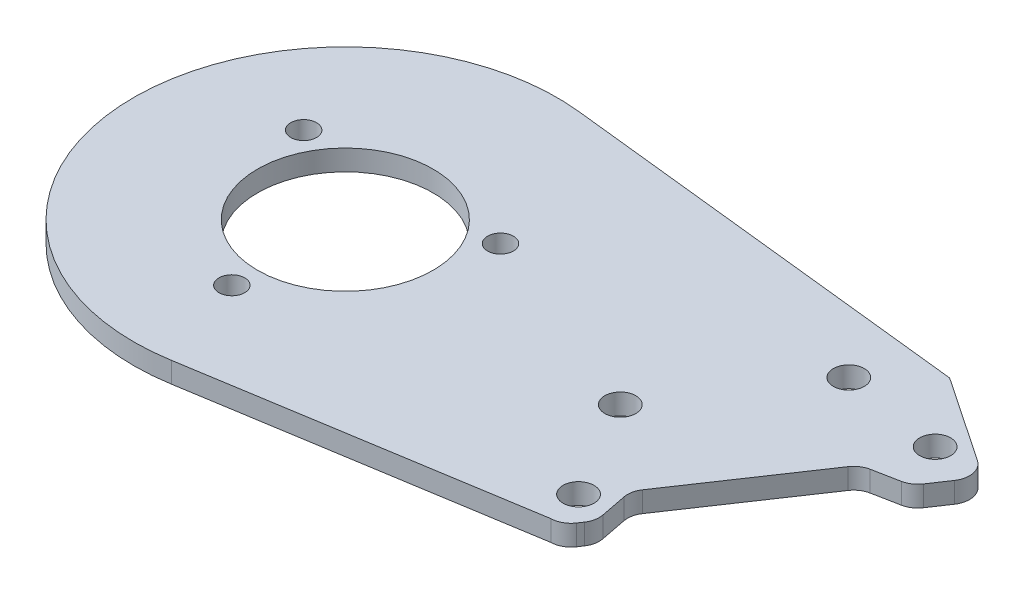
ISO-10303-21;
HEADER;
FILE_DESCRIPTION(('STEP AP214'),'2;1');
FILE_NAME('part.step','',(''),(''),'','','');
FILE_SCHEMA(('AUTOMOTIVE_DESIGN { 1 0 10303 214 1 1 1 1 }'));
ENDSEC;
DATA;
#1=APPLICATION_CONTEXT('core data for automotive mechanical design processes');
#2=APPLICATION_PROTOCOL_DEFINITION('international standard','automotive_design',2000,#1);
#3=PRODUCT_CONTEXT('',#1,'mechanical');
#4=PRODUCT('Part','Part','',(#3));
#5=PRODUCT_RELATED_PRODUCT_CATEGORY('part','',(#4));
#6=PRODUCT_DEFINITION_FORMATION('','',#4);
#7=PRODUCT_DEFINITION_CONTEXT('part definition',#1,'design');
#8=PRODUCT_DEFINITION('design','',#6,#7);
#9=PRODUCT_DEFINITION_SHAPE('','',#8);
#10=(LENGTH_UNIT() NAMED_UNIT(*) SI_UNIT(.MILLI.,.METRE.));
#11=(NAMED_UNIT(*) PLANE_ANGLE_UNIT() SI_UNIT($,.RADIAN.));
#12=(NAMED_UNIT(*) SI_UNIT($,.STERADIAN.) SOLID_ANGLE_UNIT());
#13=UNCERTAINTY_MEASURE_WITH_UNIT(LENGTH_MEASURE(1.E-05),#10,'distance_accuracy_value','');
#14=(GEOMETRIC_REPRESENTATION_CONTEXT(3) GLOBAL_UNCERTAINTY_ASSIGNED_CONTEXT((#13)) GLOBAL_UNIT_ASSIGNED_CONTEXT((#10,
#11,#12)) REPRESENTATION_CONTEXT('',''));
#15=CARTESIAN_POINT('',(0.,0.,0.));
#16=DIRECTION('',(0.,0.,1.));
#17=DIRECTION('',(1.,0.,0.));
#18=AXIS2_PLACEMENT_3D('',#15,#16,#17);
#19=CARTESIAN_POINT('',(-128.647957340767,2.,42.1311218192223));
#20=DIRECTION('',(0.,1.,0.));
#21=DIRECTION('',(0.,0.,1.));
#22=AXIS2_PLACEMENT_3D('',#19,#20,#21);
#23=PLANE('',#22);
#24=CARTESIAN_POINT('',(-94.3192578952861,2.,53.8718120369595));
#25=DIRECTION('',(0.,1.,0.));
#26=DIRECTION('',(0.,0.,1.));
#27=AXIS2_PLACEMENT_3D('',#24,#25,#26);
#28=CIRCLE('',#27,1.5);
#29=CARTESIAN_POINT('',(-94.3192578952861,2.,55.3718120369594));
#30=VERTEX_POINT('',#29);
#31=EDGE_CURVE('E328',#30,#30,#28,.T.);
#32=ORIENTED_EDGE('',*,*,#31,.F.);
#33=EDGE_LOOP('',(#32));
#34=FACE_BOUND('',#33,.T.);
#35=CARTESIAN_POINT('',(-91.0264700179937,2.,30.9865437552617));
#36=DIRECTION('',(0.,1.,0.));
#37=DIRECTION('',(0.,0.,1.));
#38=AXIS2_PLACEMENT_3D('',#35,#36,#37);
#39=CIRCLE('',#38,1.5);
#40=CARTESIAN_POINT('',(-91.0264700179937,2.,32.4865437552617));
#41=VERTEX_POINT('',#40);
#42=EDGE_CURVE('E329',#41,#41,#39,.T.);
#43=ORIENTED_EDGE('',*,*,#42,.F.);
#44=EDGE_LOOP('',(#43));
#45=FACE_BOUND('',#44,.T.);
#46=CARTESIAN_POINT('',(-99.8164198801987,2.,44.328419171265));
#47=DIRECTION('',(0.,1.,0.));
#48=DIRECTION('',(0.,0.,1.));
#49=AXIS2_PLACEMENT_3D('',#46,#47,#48);
#50=CIRCLE('',#49,1.5);
#51=CARTESIAN_POINT('',(-99.8164198801987,2.,45.8284191712649));
#52=VERTEX_POINT('',#51);
#53=EDGE_CURVE('E315',#52,#52,#50,.T.);
#54=ORIENTED_EDGE('',*,*,#53,.F.);
#55=EDGE_LOOP('',(#54));
#56=FACE_BOUND('',#55,.T.);
#57=CARTESIAN_POINT('',(-81.0355807819631,2.,32.6156306220646));
#58=DIRECTION('',(0.,1.,0.));
#59=DIRECTION('',(0.,0.,1.));
#60=AXIS2_PLACEMENT_3D('',#57,#58,#59);
#61=CIRCLE('',#60,1.5);
#62=CARTESIAN_POINT('',(-81.0355807819631,2.,34.1156306220646));
#63=VERTEX_POINT('',#62);
#64=EDGE_CURVE('E322',#63,#63,#61,.T.);
#65=ORIENTED_EDGE('',*,*,#64,.F.);
#66=EDGE_LOOP('',(#65));
#67=FACE_BOUND('',#66,.T.);
#68=CARTESIAN_POINT('',(-138.178015579846,2.,36.6376720870671));
#69=DIRECTION('',(0.,1.,0.));
#70=DIRECTION('',(0.,0.,1.));
#71=AXIS2_PLACEMENT_3D('',#68,#69,#70);
#72=CIRCLE('',#71,1.25000000004037);
#73=CARTESIAN_POINT('',(-138.178015579846,2.,37.8876720871075));
#74=VERTEX_POINT('',#73);
#75=EDGE_CURVE('E300',#74,#74,#72,.T.);
#76=ORIENTED_EDGE('',*,*,#75,.F.);
#77=EDGE_LOOP('',(#76));
#78=FACE_BOUND('',#77,.T.);
#79=CARTESIAN_POINT('',(-128.640395243687,2.,53.1311192198923));
#80=DIRECTION('',(0.,1.,0.));
#81=DIRECTION('',(0.,0.,1.));
#82=AXIS2_PLACEMENT_3D('',#79,#80,#81);
#83=CIRCLE('',#82,1.24999999990059);
#84=CARTESIAN_POINT('',(-128.640395243687,2.,54.3811192197929));
#85=VERTEX_POINT('',#84);
#86=EDGE_CURVE('E257',#85,#85,#83,.T.);
#87=ORIENTED_EDGE('',*,*,#86,.F.);
#88=EDGE_LOOP('',(#87));
#89=FACE_BOUND('',#88,.T.);
#90=DIRECTION('',(0.558620092060112,0.,-0.829423650944891));
#91=VECTOR('',#90,1.);
#92=CARTESIAN_POINT('',(-76.1604147071423,2.,32.8493651644647));
#93=LINE('',#92,#91);
#94=CARTESIAN_POINT('',(-78.4907391307527,2.,36.3093663688413));
#95=VERTEX_POINT('',#94);
#96=CARTESIAN_POINT('',(-77.2769612336691,2.,34.5071825427592));
#97=VERTEX_POINT('',#96);
#98=EDGE_CURVE('E246',#95,#97,#93,.T.);
#99=ORIENTED_EDGE('',*,*,#98,.T.);
#100=CARTESIAN_POINT('',(-78.9358085355589,2.,33.3899423586389));
#101=DIRECTION('',(0.,1.,0.));
#102=DIRECTION('',(0.,0.,1.));
#103=AXIS2_PLACEMENT_3D('',#100,#101,#102);
#104=CIRCLE('',#103,2.);
#105=CARTESIAN_POINT('',(-77.8175383235889,2.,31.7317892495985));
#106=VERTEX_POINT('',#105);
#107=EDGE_CURVE('E194',#97,#106,#104,.T.);
#108=ORIENTED_EDGE('',*,*,#107,.T.);
#109=DIRECTION('',(-0.829076554520224,0.,-0.559135105985015));
#110=VECTOR('',#109,1.);
#111=CARTESIAN_POINT('',(-86.1080853962264,2.,26.1405855291948));
#112=LINE('',#111,#110);
#113=CARTESIAN_POINT('',(-86.1080853962264,2.,26.1405855291948));
#114=VERTEX_POINT('',#113);
#115=EDGE_CURVE('E158',#106,#114,#112,.T.);
#116=ORIENTED_EDGE('',*,*,#115,.T.);
#117=DIRECTION('',(-0.994127943969974,0.,-0.1082110485026));
#118=VECTOR('',#117,1.);
#119=CARTESIAN_POINT('',(-86.1080853962264,2.,26.1405855291948));
#120=LINE('',#119,#118);
#121=CARTESIAN_POINT('',(-126.373822338493,2.,21.7576510792764));
#122=VERTEX_POINT('',#121);
#123=EDGE_CURVE('E152',#114,#122,#120,.T.);
#124=ORIENTED_EDGE('',*,*,#123,.T.);
#125=CARTESIAN_POINT('',(-128.647957340767,2.,42.1311218192223));
#126=DIRECTION('',(0.,1.,0.));
#127=DIRECTION('',(0.,0.,1.));
#128=AXIS2_PLACEMENT_3D('',#125,#126,#127);
#129=CIRCLE('',#128,20.5);
#130=CARTESIAN_POINT('',(-125.28520803499,2.,62.3534341772711));
#131=VERTEX_POINT('',#130);
#132=EDGE_CURVE('E142',#122,#131,#129,.T.);
#133=ORIENTED_EDGE('',*,*,#132,.T.);
#134=DIRECTION('',(0.987280494049973,0.,-0.158988131847762));
#135=VECTOR('',#134,1.);
#136=CARTESIAN_POINT('',(-93.626923885836,2.,57.2552969359161));
#137=LINE('',#136,#135);
#138=CARTESIAN_POINT('',(-93.626923885836,2.,57.2552969359161));
#139=VERTEX_POINT('',#138);
#140=EDGE_CURVE('E151',#131,#139,#137,.T.);
#141=ORIENTED_EDGE('',*,*,#140,.T.);
#142=CARTESIAN_POINT('',(-93.6624230696195,2.,55.2556120087461));
#143=DIRECTION('',(0.,1.,0.));
#144=DIRECTION('',(0.,0.,1.));
#145=AXIS2_PLACEMENT_3D('',#142,#143,#144);
#146=CIRCLE('',#145,2.);
#147=CARTESIAN_POINT('',(-92.0035757677297,2.,56.3728521928663));
#148=VERTEX_POINT('',#147);
#149=EDGE_CURVE('E190',#139,#148,#146,.T.);
#150=ORIENTED_EDGE('',*,*,#149,.T.);
#151=DIRECTION('',(0.558620092060103,0.,-0.829423650944897));
#152=VECTOR('',#151,1.);
#153=CARTESIAN_POINT('',(-91.2431571927658,2.,55.2438037399778));
#154=LINE('',#153,#152);
#155=CARTESIAN_POINT('',(-91.7059332294565,2.,55.9309207903266));
#156=VERTEX_POINT('',#155);
#157=EDGE_CURVE('E248',#148,#156,#154,.T.);
#158=ORIENTED_EDGE('',*,*,#157,.T.);
#159=CARTESIAN_POINT('',(-93.3647805313463,2.,54.8136806062064));
#160=DIRECTION('',(0.,1.,0.));
#161=DIRECTION('',(0.,0.,1.));
#162=AXIS2_PLACEMENT_3D('',#159,#160,#161);
#163=CIRCLE('',#162,2.);
#164=CARTESIAN_POINT('',(-91.4017902448216,2.,54.4307065404926));
#165=VERTEX_POINT('',#164);
#166=EDGE_CURVE('E188',#156,#165,#163,.T.);
#167=ORIENTED_EDGE('',*,*,#166,.T.);
#168=DIRECTION('',(-0.191487032856873,0.,-0.981495143262396));
#169=VECTOR('',#168,1.);
#170=CARTESIAN_POINT('',(-91.2431571927658,2.,55.2438037399778));
#171=LINE('',#170,#169);
#172=CARTESIAN_POINT('',(-91.8969348173643,2.,51.892769710448));
#173=VERTEX_POINT('',#172);
#174=EDGE_CURVE('E240',#165,#173,#171,.T.);
#175=ORIENTED_EDGE('',*,*,#174,.T.);
#176=CARTESIAN_POINT('',(-89.9339445308395,2.,51.5097956447342));
#177=DIRECTION('',(0.,1.,0.));
#178=DIRECTION('',(0.,0.,1.));
#179=AXIS2_PLACEMENT_3D('',#176,#177,#178);
#180=CIRCLE('',#179,2.);
#181=CARTESIAN_POINT('',(-91.5927918327293,2.,50.392555460614));
#182=VERTEX_POINT('',#181);
#183=EDGE_CURVE('E11',#173,#182,#180,.F.);
#184=ORIENTED_EDGE('',*,*,#183,.T.);
#185=DIRECTION('',(0.558620092060104,0.,-0.829423650944896));
#186=VECTOR('',#185,1.);
#187=CARTESIAN_POINT('',(-83.1176463964584,2.,37.8088940958444));
#188=LINE('',#187,#186);
#189=CARTESIAN_POINT('',(-83.5804224331492,2.,38.4960111461932));
#190=VERTEX_POINT('',#189);
#191=EDGE_CURVE('E239',#182,#190,#188,.T.);
#192=ORIENTED_EDGE('',*,*,#191,.T.);
#193=CARTESIAN_POINT('',(-81.9215751312594,2.,39.6132513303134));
#194=DIRECTION('',(0.,1.,0.));
#195=DIRECTION('',(0.,0.,1.));
#196=AXIS2_PLACEMENT_3D('',#193,#194,#195);
#197=CIRCLE('',#196,2.);
#198=CARTESIAN_POINT('',(-82.3045491969732,2.,37.6502610437886));
#199=VERTEX_POINT('',#198);
#200=EDGE_CURVE('E56',#190,#199,#197,.F.);
#201=ORIENTED_EDGE('',*,*,#200,.T.);
#202=DIRECTION('',(0.981495143262392,0.,-0.191487032856894));
#203=VECTOR('',#202,1.);
#204=CARTESIAN_POINT('',(-83.1176463964584,2.,37.8088940958444));
#205=LINE('',#204,#203);
#206=CARTESIAN_POINT('',(-79.7666123669287,2.,37.1551164712459));
#207=VERTEX_POINT('',#206);
#208=EDGE_CURVE('E244',#199,#207,#205,.T.);
#209=ORIENTED_EDGE('',*,*,#208,.T.);
#210=CARTESIAN_POINT('',(-80.1495864326425,2.,35.1921261847211));
#211=DIRECTION('',(0.,1.,0.));
#212=DIRECTION('',(0.,0.,1.));
#213=AXIS2_PLACEMENT_3D('',#210,#211,#212);
#214=CIRCLE('',#213,2.);
#215=EDGE_CURVE('E192',#207,#95,#214,.T.);
#216=ORIENTED_EDGE('',*,*,#215,.T.);
#217=EDGE_LOOP('',(#99,#108,#116,#124,#133,#141,#150,#158,#167,#175,#184,#192,#201,#209,#216));
#218=FACE_BOUND('',#217,.T.);
#219=CARTESIAN_POINT('',(-119.125461198764,2.,36.6245741507156));
#220=DIRECTION('',(0.,1.,0.));
#221=DIRECTION('',(0.,0.,1.));
#222=AXIS2_PLACEMENT_3D('',#219,#220,#221);
#223=CIRCLE('',#222,1.25000000002721);
#224=CARTESIAN_POINT('',(-119.125461198764,2.,37.8745741507428));
#225=VERTEX_POINT('',#224);
#226=EDGE_CURVE('E294',#225,#225,#223,.T.);
#227=ORIENTED_EDGE('',*,*,#226,.F.);
#228=EDGE_LOOP('',(#227));
#229=FACE_BOUND('',#228,.T.);
#230=CARTESIAN_POINT('',(-128.647957340766,2.,42.131121819225));
#231=DIRECTION('',(0.,1.,0.));
#232=DIRECTION('',(0.,0.,1.));
#233=AXIS2_PLACEMENT_3D('',#230,#231,#232);
#234=CIRCLE('',#233,8.5);
#235=CARTESIAN_POINT('',(-128.647957340766,2.,50.631121819225));
#236=VERTEX_POINT('',#235);
#237=EDGE_CURVE('E306',#236,#236,#234,.T.);
#238=ORIENTED_EDGE('',*,*,#237,.F.);
#239=EDGE_LOOP('',(#238));
#240=FACE_BOUND('',#239,.T.);
#241=ADVANCED_FACE('F34',(#34,#45,#56,#67,#78,#89,#218,#229,#240),#23,.T.);
#242=CARTESIAN_POINT('',(-128.647957340767,0.,42.1311218192223));
#243=DIRECTION('',(0.,1.,0.));
#244=DIRECTION('',(0.,0.,1.));
#245=AXIS2_PLACEMENT_3D('',#242,#243,#244);
#246=PLANE('',#245);
#247=CARTESIAN_POINT('',(-94.3192578952861,0.,53.8718120369595));
#248=DIRECTION('',(0.,1.,0.));
#249=DIRECTION('',(0.,0.,1.));
#250=AXIS2_PLACEMENT_3D('',#247,#248,#249);
#251=CIRCLE('',#250,1.5);
#252=CARTESIAN_POINT('',(-94.3192578952861,0.,55.3718120369594));
#253=VERTEX_POINT('',#252);
#254=EDGE_CURVE('E312',#253,#253,#251,.T.);
#255=ORIENTED_EDGE('',*,*,#254,.T.);
#256=EDGE_LOOP('',(#255));
#257=FACE_BOUND('',#256,.T.);
#258=CARTESIAN_POINT('',(-91.0264700179937,0.,30.9865437552617));
#259=DIRECTION('',(0.,1.,0.));
#260=DIRECTION('',(0.,0.,1.));
#261=AXIS2_PLACEMENT_3D('',#258,#259,#260);
#262=CIRCLE('',#261,1.5);
#263=CARTESIAN_POINT('',(-91.0264700179937,0.,32.4865437552617));
#264=VERTEX_POINT('',#263);
#265=EDGE_CURVE('E319',#264,#264,#262,.T.);
#266=ORIENTED_EDGE('',*,*,#265,.T.);
#267=EDGE_LOOP('',(#266));
#268=FACE_BOUND('',#267,.T.);
#269=CARTESIAN_POINT('',(-99.8164198801987,0.,44.328419171265));
#270=DIRECTION('',(0.,1.,0.));
#271=DIRECTION('',(0.,0.,1.));
#272=AXIS2_PLACEMENT_3D('',#269,#270,#271);
#273=CIRCLE('',#272,1.5);
#274=CARTESIAN_POINT('',(-99.8164198801987,0.,45.8284191712649));
#275=VERTEX_POINT('',#274);
#276=EDGE_CURVE('E318',#275,#275,#273,.T.);
#277=ORIENTED_EDGE('',*,*,#276,.T.);
#278=EDGE_LOOP('',(#277));
#279=FACE_BOUND('',#278,.T.);
#280=CARTESIAN_POINT('',(-81.0355807819631,0.,32.6156306220646));
#281=DIRECTION('',(0.,1.,0.));
#282=DIRECTION('',(0.,0.,1.));
#283=AXIS2_PLACEMENT_3D('',#280,#281,#282);
#284=CIRCLE('',#283,1.5);
#285=CARTESIAN_POINT('',(-81.0355807819631,0.,34.1156306220646));
#286=VERTEX_POINT('',#285);
#287=EDGE_CURVE('E325',#286,#286,#284,.T.);
#288=ORIENTED_EDGE('',*,*,#287,.T.);
#289=EDGE_LOOP('',(#288));
#290=FACE_BOUND('',#289,.T.);
#291=DIRECTION('',(-0.829076554520224,0.,-0.559135105985015));
#292=VECTOR('',#291,1.);
#293=CARTESIAN_POINT('',(-86.1080853962264,0.,26.1405855291948));
#294=LINE('',#293,#292);
#295=CARTESIAN_POINT('',(-77.8175383235889,0.,31.7317892495985));
#296=VERTEX_POINT('',#295);
#297=CARTESIAN_POINT('',(-86.1080853962264,0.,26.1405855291948));
#298=VERTEX_POINT('',#297);
#299=EDGE_CURVE('E162',#296,#298,#294,.T.);
#300=ORIENTED_EDGE('',*,*,#299,.F.);
#301=CARTESIAN_POINT('',(-78.9358085355589,0.,33.3899423586389));
#302=DIRECTION('',(0.,1.,0.));
#303=DIRECTION('',(0.,0.,1.));
#304=AXIS2_PLACEMENT_3D('',#301,#302,#303);
#305=CIRCLE('',#304,2.);
#306=CARTESIAN_POINT('',(-77.2769612336691,0.,34.5071825427592));
#307=VERTEX_POINT('',#306);
#308=EDGE_CURVE('E181',#296,#307,#305,.F.);
#309=ORIENTED_EDGE('',*,*,#308,.T.);
#310=DIRECTION('',(0.558620092060112,0.,-0.829423650944891));
#311=VECTOR('',#310,1.);
#312=CARTESIAN_POINT('',(-76.1604147071423,0.,32.8493651644647));
#313=LINE('',#312,#311);
#314=CARTESIAN_POINT('',(-78.4907391307527,0.,36.3093663688413));
#315=VERTEX_POINT('',#314);
#316=EDGE_CURVE('E267',#315,#307,#313,.T.);
#317=ORIENTED_EDGE('',*,*,#316,.F.);
#318=CARTESIAN_POINT('',(-80.1495864326425,0.,35.1921261847211));
#319=DIRECTION('',(0.,1.,0.));
#320=DIRECTION('',(0.,0.,1.));
#321=AXIS2_PLACEMENT_3D('',#318,#319,#320);
#322=CIRCLE('',#321,2.);
#323=CARTESIAN_POINT('',(-79.7666123669287,0.,37.1551164712459));
#324=VERTEX_POINT('',#323);
#325=EDGE_CURVE('E179',#315,#324,#322,.F.);
#326=ORIENTED_EDGE('',*,*,#325,.T.);
#327=DIRECTION('',(0.981495143262392,0.,-0.191487032856894));
#328=VECTOR('',#327,1.);
#329=CARTESIAN_POINT('',(-83.1176463964584,0.,37.8088940958444));
#330=LINE('',#329,#328);
#331=CARTESIAN_POINT('',(-82.3045491969732,0.,37.6502610437886));
#332=VERTEX_POINT('',#331);
#333=EDGE_CURVE('E265',#332,#324,#330,.T.);
#334=ORIENTED_EDGE('',*,*,#333,.F.);
#335=CARTESIAN_POINT('',(-81.9215751312594,0.,39.6132513303134));
#336=DIRECTION('',(0.,1.,0.));
#337=DIRECTION('',(0.,0.,1.));
#338=AXIS2_PLACEMENT_3D('',#335,#336,#337);
#339=CIRCLE('',#338,2.);
#340=CARTESIAN_POINT('',(-83.5804224331492,0.,38.4960111461932));
#341=VERTEX_POINT('',#340);
#342=EDGE_CURVE('E215',#332,#341,#339,.T.);
#343=ORIENTED_EDGE('',*,*,#342,.T.);
#344=DIRECTION('',(0.558620092060104,0.,-0.829423650944896));
#345=VECTOR('',#344,1.);
#346=CARTESIAN_POINT('',(-83.1176463964584,0.,37.8088940958444));
#347=LINE('',#346,#345);
#348=CARTESIAN_POINT('',(-91.5927918327293,0.,50.392555460614));
#349=VERTEX_POINT('',#348);
#350=EDGE_CURVE('E226',#349,#341,#347,.T.);
#351=ORIENTED_EDGE('',*,*,#350,.F.);
#352=CARTESIAN_POINT('',(-89.9339445308395,0.,51.5097956447342));
#353=DIRECTION('',(0.,1.,0.));
#354=DIRECTION('',(0.,0.,1.));
#355=AXIS2_PLACEMENT_3D('',#352,#353,#354);
#356=CIRCLE('',#355,2.);
#357=CARTESIAN_POINT('',(-91.8969348173643,0.,51.892769710448));
#358=VERTEX_POINT('',#357);
#359=EDGE_CURVE('E42',#349,#358,#356,.T.);
#360=ORIENTED_EDGE('',*,*,#359,.T.);
#361=DIRECTION('',(-0.191487032856873,0.,-0.981495143262396));
#362=VECTOR('',#361,1.);
#363=CARTESIAN_POINT('',(-91.2431571927658,0.,55.2438037399778));
#364=LINE('',#363,#362);
#365=CARTESIAN_POINT('',(-91.4017902448216,0.,54.4307065404926));
#366=VERTEX_POINT('',#365);
#367=EDGE_CURVE('E224',#366,#358,#364,.T.);
#368=ORIENTED_EDGE('',*,*,#367,.F.);
#369=CARTESIAN_POINT('',(-93.3647805313463,0.,54.8136806062064));
#370=DIRECTION('',(0.,1.,0.));
#371=DIRECTION('',(0.,0.,1.));
#372=AXIS2_PLACEMENT_3D('',#369,#370,#371);
#373=CIRCLE('',#372,2.);
#374=CARTESIAN_POINT('',(-91.7059332294565,0.,55.9309207903266));
#375=VERTEX_POINT('',#374);
#376=EDGE_CURVE('E170',#366,#375,#373,.F.);
#377=ORIENTED_EDGE('',*,*,#376,.T.);
#378=DIRECTION('',(0.558620092060103,0.,-0.829423650944897));
#379=VECTOR('',#378,1.);
#380=CARTESIAN_POINT('',(-91.2431571927658,0.,55.2438037399778));
#381=LINE('',#380,#379);
#382=CARTESIAN_POINT('',(-92.0035757677297,0.,56.3728521928663));
#383=VERTEX_POINT('',#382);
#384=EDGE_CURVE('E235',#383,#375,#381,.T.);
#385=ORIENTED_EDGE('',*,*,#384,.F.);
#386=CARTESIAN_POINT('',(-93.6624230696195,0.,55.2556120087461));
#387=DIRECTION('',(0.,1.,0.));
#388=DIRECTION('',(0.,0.,1.));
#389=AXIS2_PLACEMENT_3D('',#386,#387,#388);
#390=CIRCLE('',#389,2.);
#391=CARTESIAN_POINT('',(-93.626923885836,0.,57.2552969359161));
#392=VERTEX_POINT('',#391);
#393=EDGE_CURVE('E177',#383,#392,#390,.F.);
#394=ORIENTED_EDGE('',*,*,#393,.T.);
#395=DIRECTION('',(0.987280494049973,0.,-0.158988131847762));
#396=VECTOR('',#395,1.);
#397=CARTESIAN_POINT('',(-93.626923885836,0.,57.2552969359161));
#398=LINE('',#397,#396);
#399=CARTESIAN_POINT('',(-125.28520803499,0.,62.3534341772711));
#400=VERTEX_POINT('',#399);
#401=EDGE_CURVE('E259',#400,#392,#398,.T.);
#402=ORIENTED_EDGE('',*,*,#401,.F.);
#403=CARTESIAN_POINT('',(-128.647957340767,0.,42.1311218192223));
#404=DIRECTION('',(0.,1.,0.));
#405=DIRECTION('',(0.,0.,1.));
#406=AXIS2_PLACEMENT_3D('',#403,#404,#405);
#407=CIRCLE('',#406,20.5);
#408=CARTESIAN_POINT('',(-126.373822338493,0.,21.7576510792764));
#409=VERTEX_POINT('',#408);
#410=EDGE_CURVE('E256',#409,#400,#407,.T.);
#411=ORIENTED_EDGE('',*,*,#410,.F.);
#412=DIRECTION('',(-0.994127943969974,0.,-0.1082110485026));
#413=VECTOR('',#412,1.);
#414=CARTESIAN_POINT('',(-86.1080853962264,0.,26.1405855291948));
#415=LINE('',#414,#413);
#416=EDGE_CURVE('E166',#298,#409,#415,.T.);
#417=ORIENTED_EDGE('',*,*,#416,.F.);
#418=EDGE_LOOP('',(#300,#309,#317,#326,#334,#343,#351,#360,#368,#377,#385,#394,#402,#411,#417));
#419=FACE_BOUND('',#418,.T.);
#420=CARTESIAN_POINT('',(-128.640395243687,0.,53.1311192198923));
#421=DIRECTION('',(0.,1.,0.));
#422=DIRECTION('',(0.,0.,1.));
#423=AXIS2_PLACEMENT_3D('',#420,#421,#422);
#424=CIRCLE('',#423,1.24999999990059);
#425=CARTESIAN_POINT('',(-128.640395243687,0.,54.3811192197929));
#426=VERTEX_POINT('',#425);
#427=EDGE_CURVE('E291',#426,#426,#424,.T.);
#428=ORIENTED_EDGE('',*,*,#427,.T.);
#429=EDGE_LOOP('',(#428));
#430=FACE_BOUND('',#429,.T.);
#431=CARTESIAN_POINT('',(-119.125461198764,0.,36.6245741507156));
#432=DIRECTION('',(0.,1.,0.));
#433=DIRECTION('',(0.,0.,1.));
#434=AXIS2_PLACEMENT_3D('',#431,#432,#433);
#435=CIRCLE('',#434,1.25000000002721);
#436=CARTESIAN_POINT('',(-119.125461198764,0.,37.8745741507428));
#437=VERTEX_POINT('',#436);
#438=EDGE_CURVE('E297',#437,#437,#435,.T.);
#439=ORIENTED_EDGE('',*,*,#438,.T.);
#440=EDGE_LOOP('',(#439));
#441=FACE_BOUND('',#440,.T.);
#442=CARTESIAN_POINT('',(-138.178015579846,0.,36.6376720870671));
#443=DIRECTION('',(0.,1.,0.));
#444=DIRECTION('',(0.,0.,1.));
#445=AXIS2_PLACEMENT_3D('',#442,#443,#444);
#446=CIRCLE('',#445,1.25000000004037);
#447=CARTESIAN_POINT('',(-138.178015579846,0.,37.8876720871075));
#448=VERTEX_POINT('',#447);
#449=EDGE_CURVE('E303',#448,#448,#446,.T.);
#450=ORIENTED_EDGE('',*,*,#449,.T.);
#451=EDGE_LOOP('',(#450));
#452=FACE_BOUND('',#451,.T.);
#453=CARTESIAN_POINT('',(-128.647957340766,0.,42.131121819225));
#454=DIRECTION('',(0.,1.,0.));
#455=DIRECTION('',(0.,0.,1.));
#456=AXIS2_PLACEMENT_3D('',#453,#454,#455);
#457=CIRCLE('',#456,8.5);
#458=CARTESIAN_POINT('',(-128.647957340766,0.,50.631121819225));
#459=VERTEX_POINT('',#458);
#460=EDGE_CURVE('E309',#459,#459,#457,.T.);
#461=ORIENTED_EDGE('',*,*,#460,.T.);
#462=EDGE_LOOP('',(#461));
#463=FACE_BOUND('',#462,.T.);
#464=ADVANCED_FACE('F222',(#257,#268,#279,#290,#419,#430,#441,#452,#463),#246,.F.);
#465=CARTESIAN_POINT('',(-86.1080853962264,2.,26.1405855291948));
#466=DIRECTION('',(-0.1082110485026,0.,0.994127943969974));
#467=DIRECTION('',(0.994127943969974,0.,0.1082110485026));
#468=AXIS2_PLACEMENT_3D('',#465,#466,#467);
#469=PLANE('',#468);
#470=ORIENTED_EDGE('',*,*,#416,.T.);
#471=DIRECTION('',(0.,-1.,0.));
#472=VECTOR('',#471,1.);
#473=CARTESIAN_POINT('',(-126.373822338493,2.,21.7576510792764));
#474=LINE('',#473,#472);
#475=EDGE_CURVE('E146',#122,#409,#474,.T.);
#476=ORIENTED_EDGE('',*,*,#475,.F.);
#477=ORIENTED_EDGE('',*,*,#123,.F.);
#478=DIRECTION('',(0.,-1.,0.));
#479=VECTOR('',#478,1.);
#480=CARTESIAN_POINT('',(-86.1080853962264,2.,26.1405855291948));
#481=LINE('',#480,#479);
#482=EDGE_CURVE('E254',#114,#298,#481,.T.);
#483=ORIENTED_EDGE('',*,*,#482,.T.);
#484=EDGE_LOOP('',(#470,#476,#477,#483));
#485=FACE_BOUND('',#484,.T.);
#486=ADVANCED_FACE('F164',(#485),#469,.F.);
#487=CARTESIAN_POINT('',(-128.647957340767,2.,42.1311218192223));
#488=DIRECTION('',(0.,-1.,0.));
#489=DIRECTION('',(0.,0.,-1.));
#490=AXIS2_PLACEMENT_3D('',#487,#488,#489);
#491=CYLINDRICAL_SURFACE('',#490,20.5);
#492=ORIENTED_EDGE('',*,*,#410,.T.);
#493=DIRECTION('',(0.,-1.,0.));
#494=VECTOR('',#493,1.);
#495=CARTESIAN_POINT('',(-125.28520803499,2.,62.3534341772711));
#496=LINE('',#495,#494);
#497=EDGE_CURVE('E149',#131,#400,#496,.T.);
#498=ORIENTED_EDGE('',*,*,#497,.F.);
#499=ORIENTED_EDGE('',*,*,#132,.F.);
#500=ORIENTED_EDGE('',*,*,#475,.T.);
#501=EDGE_LOOP('',(#492,#498,#499,#500));
#502=FACE_BOUND('',#501,.T.);
#503=ADVANCED_FACE('F144',(#502),#491,.T.);
#504=CARTESIAN_POINT('',(-93.626923885836,2.,57.2552969359161));
#505=DIRECTION('',(-0.158988131847762,0.,-0.987280494049973));
#506=DIRECTION('',(-0.987280494049973,0.,0.158988131847762));
#507=AXIS2_PLACEMENT_3D('',#504,#505,#506);
#508=PLANE('',#507);
#509=ORIENTED_EDGE('',*,*,#401,.T.);
#510=DIRECTION('',(0.,-1.,0.));
#511=VECTOR('',#510,1.);
#512=CARTESIAN_POINT('',(-93.626923885836,2.,57.2552969359161));
#513=LINE('',#512,#511);
#514=EDGE_CURVE('E172',#139,#392,#513,.T.);
#515=ORIENTED_EDGE('',*,*,#514,.F.);
#516=ORIENTED_EDGE('',*,*,#140,.F.);
#517=ORIENTED_EDGE('',*,*,#497,.T.);
#518=EDGE_LOOP('',(#509,#515,#516,#517));
#519=FACE_BOUND('',#518,.T.);
#520=ADVANCED_FACE('F278',(#519),#508,.F.);
#521=CARTESIAN_POINT('',(-91.2431571927658,2.,55.2438037399778));
#522=DIRECTION('',(-0.829423650944897,0.,-0.558620092060103));
#523=DIRECTION('',(-0.558620092060103,0.,0.829423650944897));
#524=AXIS2_PLACEMENT_3D('',#521,#522,#523);
#525=PLANE('',#524);
#526=ORIENTED_EDGE('',*,*,#157,.F.);
#527=DIRECTION('',(0.,1.,0.));
#528=VECTOR('',#527,1.);
#529=CARTESIAN_POINT('',(-92.0035757677297,2.,56.3728521928663));
#530=LINE('',#529,#528);
#531=EDGE_CURVE('E207',#148,#383,#530,.F.);
#532=ORIENTED_EDGE('',*,*,#531,.T.);
#533=ORIENTED_EDGE('',*,*,#384,.T.);
#534=DIRECTION('',(0.,-1.,0.));
#535=VECTOR('',#534,1.);
#536=CARTESIAN_POINT('',(-91.7059332294565,2.,55.9309207903266));
#537=LINE('',#536,#535);
#538=EDGE_CURVE('E205',#375,#156,#537,.F.);
#539=ORIENTED_EDGE('',*,*,#538,.T.);
#540=EDGE_LOOP('',(#526,#532,#533,#539));
#541=FACE_BOUND('',#540,.T.);
#542=ADVANCED_FACE('F284',(#541),#525,.F.);
#543=CARTESIAN_POINT('',(-91.2431571927658,2.,55.2438037399778));
#544=DIRECTION('',(-0.981495143262396,0.,0.191487032856873));
#545=DIRECTION('',(0.191487032856873,0.,0.981495143262396));
#546=AXIS2_PLACEMENT_3D('',#543,#544,#545);
#547=PLANE('',#546);
#548=ORIENTED_EDGE('',*,*,#174,.F.);
#549=DIRECTION('',(0.,-1.,0.));
#550=VECTOR('',#549,1.);
#551=CARTESIAN_POINT('',(-91.4017902448216,2.,54.4307065404926));
#552=LINE('',#551,#550);
#553=EDGE_CURVE('E212',#165,#366,#552,.T.);
#554=ORIENTED_EDGE('',*,*,#553,.T.);
#555=ORIENTED_EDGE('',*,*,#367,.T.);
#556=DIRECTION('',(0.,-1.,0.));
#557=VECTOR('',#556,1.);
#558=CARTESIAN_POINT('',(-91.8969348173643,2.,51.892769710448));
#559=LINE('',#558,#557);
#560=EDGE_CURVE('E210',#358,#173,#559,.F.);
#561=ORIENTED_EDGE('',*,*,#560,.T.);
#562=EDGE_LOOP('',(#548,#554,#555,#561));
#563=FACE_BOUND('',#562,.T.);
#564=ADVANCED_FACE('F232',(#563),#547,.F.);
#565=CARTESIAN_POINT('',(-83.1176463964584,2.,37.8088940958444));
#566=DIRECTION('',(-0.829423650944896,0.,-0.558620092060104));
#567=DIRECTION('',(-0.558620092060104,0.,0.829423650944897));
#568=AXIS2_PLACEMENT_3D('',#565,#566,#567);
#569=PLANE('',#568);
#570=ORIENTED_EDGE('',*,*,#350,.T.);
#571=DIRECTION('',(0.,-1.,0.));
#572=VECTOR('',#571,1.);
#573=CARTESIAN_POINT('',(-83.5804224331492,2.,38.4960111461932));
#574=LINE('',#573,#572);
#575=EDGE_CURVE('E203',#341,#190,#574,.F.);
#576=ORIENTED_EDGE('',*,*,#575,.T.);
#577=ORIENTED_EDGE('',*,*,#191,.F.);
#578=DIRECTION('',(0.,-1.,0.));
#579=VECTOR('',#578,1.);
#580=CARTESIAN_POINT('',(-91.5927918327293,0.,50.392555460614));
#581=LINE('',#580,#579);
#582=EDGE_CURVE('E200',#182,#349,#581,.T.);
#583=ORIENTED_EDGE('',*,*,#582,.T.);
#584=EDGE_LOOP('',(#570,#576,#577,#583));
#585=FACE_BOUND('',#584,.T.);
#586=ADVANCED_FACE('F242',(#585),#569,.F.);
#587=CARTESIAN_POINT('',(-83.1176463964584,2.,37.8088940958444));
#588=DIRECTION('',(-0.191487032856894,0.,-0.981495143262392));
#589=DIRECTION('',(-0.981495143262392,0.,0.191487032856894));
#590=AXIS2_PLACEMENT_3D('',#587,#588,#589);
#591=PLANE('',#590);
#592=ORIENTED_EDGE('',*,*,#333,.T.);
#593=DIRECTION('',(0.,-1.,0.));
#594=VECTOR('',#593,1.);
#595=CARTESIAN_POINT('',(-79.7666123669287,2.,37.1551164712459));
#596=LINE('',#595,#594);
#597=EDGE_CURVE('E49',#324,#207,#596,.F.);
#598=ORIENTED_EDGE('',*,*,#597,.T.);
#599=ORIENTED_EDGE('',*,*,#208,.F.);
#600=DIRECTION('',(0.,-1.,0.));
#601=VECTOR('',#600,1.);
#602=CARTESIAN_POINT('',(-82.3045491969732,0.,37.6502610437886));
#603=LINE('',#602,#601);
#604=EDGE_CURVE('E196',#199,#332,#603,.T.);
#605=ORIENTED_EDGE('',*,*,#604,.T.);
#606=EDGE_LOOP('',(#592,#598,#599,#605));
#607=FACE_BOUND('',#606,.T.);
#608=ADVANCED_FACE('F385',(#607),#591,.F.);
#609=CARTESIAN_POINT('',(-76.1604147071423,2.,32.8493651644647));
#610=DIRECTION('',(-0.829423650944891,0.,-0.558620092060112));
#611=DIRECTION('',(-0.558620092060112,0.,0.829423650944891));
#612=AXIS2_PLACEMENT_3D('',#609,#610,#611);
#613=PLANE('',#612);
#614=ORIENTED_EDGE('',*,*,#316,.T.);
#615=DIRECTION('',(0.,-1.,0.));
#616=VECTOR('',#615,1.);
#617=CARTESIAN_POINT('',(-77.2769612336691,2.,34.5071825427592));
#618=LINE('',#617,#616);
#619=EDGE_CURVE('E186',#307,#97,#618,.F.);
#620=ORIENTED_EDGE('',*,*,#619,.T.);
#621=ORIENTED_EDGE('',*,*,#98,.F.);
#622=DIRECTION('',(0.,-1.,0.));
#623=VECTOR('',#622,1.);
#624=CARTESIAN_POINT('',(-78.4907391307527,2.,36.3093663688413));
#625=LINE('',#624,#623);
#626=EDGE_CURVE('E183',#95,#315,#625,.T.);
#627=ORIENTED_EDGE('',*,*,#626,.T.);
#628=EDGE_LOOP('',(#614,#620,#621,#627));
#629=FACE_BOUND('',#628,.T.);
#630=ADVANCED_FACE('F375',(#629),#613,.F.);
#631=CARTESIAN_POINT('',(-86.1080853962264,2.,26.1405855291948));
#632=DIRECTION('',(-0.559135105985015,0.,0.829076554520224));
#633=DIRECTION('',(0.829076554520224,0.,0.559135105985015));
#634=AXIS2_PLACEMENT_3D('',#631,#632,#633);
#635=PLANE('',#634);
#636=ORIENTED_EDGE('',*,*,#115,.F.);
#637=DIRECTION('',(0.,-1.,0.));
#638=VECTOR('',#637,1.);
#639=CARTESIAN_POINT('',(-77.8175383235889,2.,31.7317892495985));
#640=LINE('',#639,#638);
#641=EDGE_CURVE('E167',#106,#296,#640,.T.);
#642=ORIENTED_EDGE('',*,*,#641,.T.);
#643=ORIENTED_EDGE('',*,*,#299,.T.);
#644=ORIENTED_EDGE('',*,*,#482,.F.);
#645=EDGE_LOOP('',(#636,#642,#643,#644));
#646=FACE_BOUND('',#645,.T.);
#647=ADVANCED_FACE('F365',(#646),#635,.F.);
#648=CARTESIAN_POINT('',(-128.640395243687,2.,53.1311192198923));
#649=DIRECTION('',(0.,-1.,0.));
#650=DIRECTION('',(0.,0.,-1.));
#651=AXIS2_PLACEMENT_3D('',#648,#649,#650);
#652=CYLINDRICAL_SURFACE('',#651,1.24999999990059);
#653=ORIENTED_EDGE('',*,*,#427,.F.);
#654=EDGE_LOOP('',(#653));
#655=FACE_BOUND('',#654,.T.);
#656=ORIENTED_EDGE('',*,*,#86,.T.);
#657=EDGE_LOOP('',(#656));
#658=FACE_BOUND('',#657,.T.);
#659=ADVANCED_FACE('F362',(#655,#658),#652,.F.);
#660=CARTESIAN_POINT('',(-119.125461198764,2.,36.6245741507156));
#661=DIRECTION('',(0.,-1.,0.));
#662=DIRECTION('',(0.,0.,-1.));
#663=AXIS2_PLACEMENT_3D('',#660,#661,#662);
#664=CYLINDRICAL_SURFACE('',#663,1.25000000002721);
#665=ORIENTED_EDGE('',*,*,#438,.F.);
#666=EDGE_LOOP('',(#665));
#667=FACE_BOUND('',#666,.T.);
#668=ORIENTED_EDGE('',*,*,#226,.T.);
#669=EDGE_LOOP('',(#668));
#670=FACE_BOUND('',#669,.T.);
#671=ADVANCED_FACE('F364',(#667,#670),#664,.F.);
#672=CARTESIAN_POINT('',(-138.178015579846,2.,36.6376720870671));
#673=DIRECTION('',(0.,-1.,0.));
#674=DIRECTION('',(0.,0.,-1.));
#675=AXIS2_PLACEMENT_3D('',#672,#673,#674);
#676=CYLINDRICAL_SURFACE('',#675,1.25000000004037);
#677=ORIENTED_EDGE('',*,*,#449,.F.);
#678=EDGE_LOOP('',(#677));
#679=FACE_BOUND('',#678,.T.);
#680=ORIENTED_EDGE('',*,*,#75,.T.);
#681=EDGE_LOOP('',(#680));
#682=FACE_BOUND('',#681,.T.);
#683=ADVANCED_FACE('F372',(#679,#682),#676,.F.);
#684=CARTESIAN_POINT('',(-128.647957340766,2.,42.131121819225));
#685=DIRECTION('',(0.,-1.,0.));
#686=DIRECTION('',(0.,0.,-1.));
#687=AXIS2_PLACEMENT_3D('',#684,#685,#686);
#688=CYLINDRICAL_SURFACE('',#687,8.5);
#689=ORIENTED_EDGE('',*,*,#460,.F.);
#690=EDGE_LOOP('',(#689));
#691=FACE_BOUND('',#690,.T.);
#692=ORIENTED_EDGE('',*,*,#237,.T.);
#693=EDGE_LOOP('',(#692));
#694=FACE_BOUND('',#693,.T.);
#695=ADVANCED_FACE('F539',(#691,#694),#688,.F.);
#696=CARTESIAN_POINT('',(-81.0355807819631,0.,32.6156306220646));
#697=DIRECTION('',(0.,1.,0.));
#698=DIRECTION('',(0.,0.,1.));
#699=AXIS2_PLACEMENT_3D('',#696,#697,#698);
#700=CYLINDRICAL_SURFACE('',#699,1.5);
#701=ORIENTED_EDGE('',*,*,#287,.F.);
#702=EDGE_LOOP('',(#701));
#703=FACE_BOUND('',#702,.T.);
#704=ORIENTED_EDGE('',*,*,#64,.T.);
#705=EDGE_LOOP('',(#704));
#706=FACE_BOUND('',#705,.T.);
#707=ADVANCED_FACE('F529',(#703,#706),#700,.F.);
#708=CARTESIAN_POINT('',(-99.8164198801987,0.,44.328419171265));
#709=DIRECTION('',(0.,1.,0.));
#710=DIRECTION('',(0.,0.,1.));
#711=AXIS2_PLACEMENT_3D('',#708,#709,#710);
#712=CYLINDRICAL_SURFACE('',#711,1.5);
#713=ORIENTED_EDGE('',*,*,#276,.F.);
#714=EDGE_LOOP('',(#713));
#715=FACE_BOUND('',#714,.T.);
#716=ORIENTED_EDGE('',*,*,#53,.T.);
#717=EDGE_LOOP('',(#716));
#718=FACE_BOUND('',#717,.T.);
#719=ADVANCED_FACE('F519',(#715,#718),#712,.F.);
#720=CARTESIAN_POINT('',(-91.0264700179937,0.,30.9865437552617));
#721=DIRECTION('',(0.,1.,0.));
#722=DIRECTION('',(0.,0.,1.));
#723=AXIS2_PLACEMENT_3D('',#720,#721,#722);
#724=CYLINDRICAL_SURFACE('',#723,1.5);
#725=ORIENTED_EDGE('',*,*,#265,.F.);
#726=EDGE_LOOP('',(#725));
#727=FACE_BOUND('',#726,.T.);
#728=ORIENTED_EDGE('',*,*,#42,.T.);
#729=EDGE_LOOP('',(#728));
#730=FACE_BOUND('',#729,.T.);
#731=ADVANCED_FACE('F345',(#727,#730),#724,.F.);
#732=CARTESIAN_POINT('',(-94.3192578952861,0.,53.8718120369595));
#733=DIRECTION('',(0.,1.,0.));
#734=DIRECTION('',(0.,0.,1.));
#735=AXIS2_PLACEMENT_3D('',#732,#733,#734);
#736=CYLINDRICAL_SURFACE('',#735,1.5);
#737=ORIENTED_EDGE('',*,*,#254,.F.);
#738=EDGE_LOOP('',(#737));
#739=FACE_BOUND('',#738,.T.);
#740=ORIENTED_EDGE('',*,*,#31,.T.);
#741=EDGE_LOOP('',(#740));
#742=FACE_BOUND('',#741,.T.);
#743=ADVANCED_FACE('F341',(#739,#742),#736,.F.);
#744=CARTESIAN_POINT('',(-78.9358085355589,2.,33.3899423586389));
#745=DIRECTION('',(0.,-1.,0.));
#746=DIRECTION('',(0.,0.,-1.));
#747=AXIS2_PLACEMENT_3D('',#744,#745,#746);
#748=CYLINDRICAL_SURFACE('',#747,2.);
#749=ORIENTED_EDGE('',*,*,#107,.F.);
#750=ORIENTED_EDGE('',*,*,#619,.F.);
#751=ORIENTED_EDGE('',*,*,#308,.F.);
#752=ORIENTED_EDGE('',*,*,#641,.F.);
#753=EDGE_LOOP('',(#749,#750,#751,#752));
#754=FACE_BOUND('',#753,.T.);
#755=ADVANCED_FACE('F344',(#754),#748,.T.);
#756=CARTESIAN_POINT('',(-80.1495864326425,2.,35.1921261847211));
#757=DIRECTION('',(0.,-1.,0.));
#758=DIRECTION('',(0.,0.,-1.));
#759=AXIS2_PLACEMENT_3D('',#756,#757,#758);
#760=CYLINDRICAL_SURFACE('',#759,2.);
#761=ORIENTED_EDGE('',*,*,#215,.F.);
#762=ORIENTED_EDGE('',*,*,#597,.F.);
#763=ORIENTED_EDGE('',*,*,#325,.F.);
#764=ORIENTED_EDGE('',*,*,#626,.F.);
#765=EDGE_LOOP('',(#761,#762,#763,#764));
#766=FACE_BOUND('',#765,.T.);
#767=ADVANCED_FACE('F403',(#766),#760,.T.);
#768=CARTESIAN_POINT('',(-81.9215751312594,2.,39.6132513303134));
#769=DIRECTION('',(0.,1.,0.));
#770=DIRECTION('',(0.,0.,1.));
#771=AXIS2_PLACEMENT_3D('',#768,#769,#770);
#772=CYLINDRICAL_SURFACE('',#771,2.);
#773=ORIENTED_EDGE('',*,*,#200,.F.);
#774=ORIENTED_EDGE('',*,*,#575,.F.);
#775=ORIENTED_EDGE('',*,*,#342,.F.);
#776=ORIENTED_EDGE('',*,*,#604,.F.);
#777=EDGE_LOOP('',(#773,#774,#775,#776));
#778=FACE_BOUND('',#777,.T.);
#779=ADVANCED_FACE('F407',(#778),#772,.F.);
#780=CARTESIAN_POINT('',(-93.6624230696195,2.,55.2556120087461));
#781=DIRECTION('',(0.,1.,0.));
#782=DIRECTION('',(0.,0.,1.));
#783=AXIS2_PLACEMENT_3D('',#780,#781,#782);
#784=CYLINDRICAL_SURFACE('',#783,2.);
#785=ORIENTED_EDGE('',*,*,#149,.F.);
#786=ORIENTED_EDGE('',*,*,#514,.T.);
#787=ORIENTED_EDGE('',*,*,#393,.F.);
#788=ORIENTED_EDGE('',*,*,#531,.F.);
#789=EDGE_LOOP('',(#785,#786,#787,#788));
#790=FACE_BOUND('',#789,.T.);
#791=ADVANCED_FACE('F275',(#790),#784,.T.);
#792=CARTESIAN_POINT('',(-93.3647805313463,2.,54.8136806062064));
#793=DIRECTION('',(0.,-1.,0.));
#794=DIRECTION('',(0.,0.,-1.));
#795=AXIS2_PLACEMENT_3D('',#792,#793,#794);
#796=CYLINDRICAL_SURFACE('',#795,2.);
#797=ORIENTED_EDGE('',*,*,#166,.F.);
#798=ORIENTED_EDGE('',*,*,#538,.F.);
#799=ORIENTED_EDGE('',*,*,#376,.F.);
#800=ORIENTED_EDGE('',*,*,#553,.F.);
#801=EDGE_LOOP('',(#797,#798,#799,#800));
#802=FACE_BOUND('',#801,.T.);
#803=ADVANCED_FACE('F288',(#802),#796,.T.);
#804=CARTESIAN_POINT('',(-89.9339445308395,2.,51.5097956447342));
#805=DIRECTION('',(0.,1.,0.));
#806=DIRECTION('',(0.,0.,1.));
#807=AXIS2_PLACEMENT_3D('',#804,#805,#806);
#808=CYLINDRICAL_SURFACE('',#807,2.);
#809=ORIENTED_EDGE('',*,*,#183,.F.);
#810=ORIENTED_EDGE('',*,*,#560,.F.);
#811=ORIENTED_EDGE('',*,*,#359,.F.);
#812=ORIENTED_EDGE('',*,*,#582,.F.);
#813=EDGE_LOOP('',(#809,#810,#811,#812));
#814=FACE_BOUND('',#813,.T.);
#815=ADVANCED_FACE('F36',(#814),#808,.F.);
#816=CLOSED_SHELL('',(#241,#464,#486,#503,#520,#542,#564,#586,#608,#630,#647,#659,#671,#683,
#695,#707,#719,#731,#743,#755,#767,#779,#791,#803,#815));
#817=MANIFOLD_SOLID_BREP('B2',#816);
#818=ADVANCED_BREP_SHAPE_REPRESENTATION('',(#18,#817),#14);
#819=SHAPE_DEFINITION_REPRESENTATION(#9,#818);
ENDSEC;
END-ISO-10303-21;
